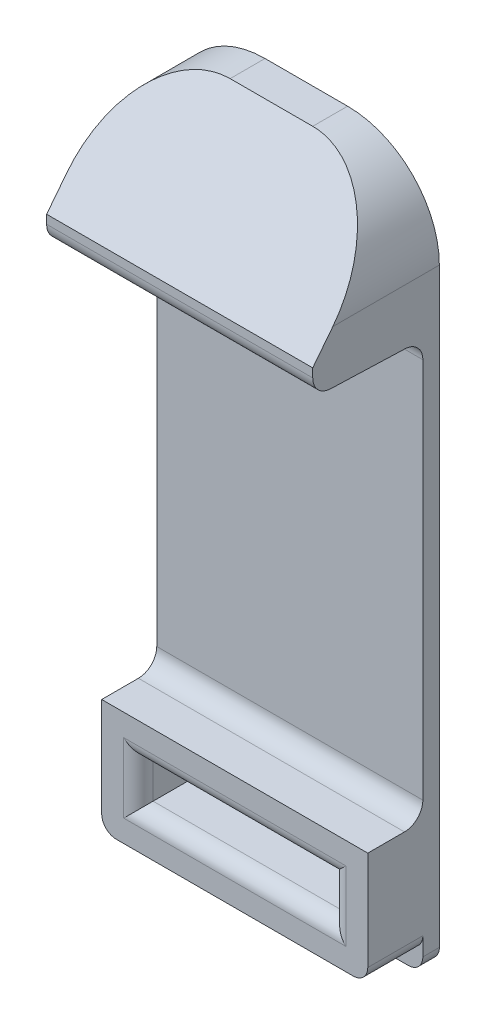
ISO-10303-21;
HEADER;
FILE_DESCRIPTION(('STEP AP214'),'2;1');
FILE_NAME('part.step','',(''),(''),'','','');
FILE_SCHEMA(('AUTOMOTIVE_DESIGN { 1 0 10303 214 1 1 1 1 }'));
ENDSEC;
DATA;
#1=APPLICATION_CONTEXT('core data for automotive mechanical design processes');
#2=APPLICATION_PROTOCOL_DEFINITION('international standard','automotive_design',2000,#1);
#3=PRODUCT_CONTEXT('',#1,'mechanical');
#4=PRODUCT('Part','Part','',(#3));
#5=PRODUCT_RELATED_PRODUCT_CATEGORY('part','',(#4));
#6=PRODUCT_DEFINITION_FORMATION('','',#4);
#7=PRODUCT_DEFINITION_CONTEXT('part definition',#1,'design');
#8=PRODUCT_DEFINITION('design','',#6,#7);
#9=PRODUCT_DEFINITION_SHAPE('','',#8);
#10=(LENGTH_UNIT() NAMED_UNIT(*) SI_UNIT(.MILLI.,.METRE.));
#11=(NAMED_UNIT(*) PLANE_ANGLE_UNIT() SI_UNIT($,.RADIAN.));
#12=(NAMED_UNIT(*) SI_UNIT($,.STERADIAN.) SOLID_ANGLE_UNIT());
#13=UNCERTAINTY_MEASURE_WITH_UNIT(LENGTH_MEASURE(1.E-05),#10,'distance_accuracy_value','');
#14=(GEOMETRIC_REPRESENTATION_CONTEXT(3) GLOBAL_UNCERTAINTY_ASSIGNED_CONTEXT((#13)) GLOBAL_UNIT_ASSIGNED_CONTEXT((#10,
#11,#12)) REPRESENTATION_CONTEXT('',''));
#15=CARTESIAN_POINT('',(0.,0.,0.));
#16=DIRECTION('',(0.,0.,1.));
#17=DIRECTION('',(1.,0.,0.));
#18=AXIS2_PLACEMENT_3D('',#15,#16,#17);
#19=CARTESIAN_POINT('',(0.,0.,0.9));
#20=DIRECTION('',(0.,0.,-1.));
#21=DIRECTION('',(-1.,0.,0.));
#22=AXIS2_PLACEMENT_3D('',#19,#20,#21);
#23=PLANE('',#22);
#24=DIRECTION('',(0.,1.,0.));
#25=VECTOR('',#24,1.);
#26=CARTESIAN_POINT('',(7.25,-3.,0.9));
#27=LINE('',#26,#25);
#28=CARTESIAN_POINT('',(7.25,5.19999999999999,0.9));
#29=VERTEX_POINT('',#28);
#30=CARTESIAN_POINT('',(7.25000000000001,25.9843112251929,0.9));
#31=VERTEX_POINT('',#30);
#32=EDGE_CURVE('E281',#29,#31,#27,.T.);
#33=ORIENTED_EDGE('',*,*,#32,.T.);
#34=DIRECTION('',(-1.,0.,0.));
#35=VECTOR('',#34,1.);
#36=CARTESIAN_POINT('',(-7.25,25.9843112251929,0.9));
#37=LINE('',#36,#35);
#38=CARTESIAN_POINT('',(-7.25000000000001,25.9843112251929,0.9));
#39=VERTEX_POINT('',#38);
#40=EDGE_CURVE('E323',#31,#39,#37,.T.);
#41=ORIENTED_EDGE('',*,*,#40,.T.);
#42=DIRECTION('',(0.,-1.,0.));
#43=VECTOR('',#42,1.);
#44=CARTESIAN_POINT('',(-7.25,-3.,0.9));
#45=LINE('',#44,#43);
#46=CARTESIAN_POINT('',(-7.25,5.19999999999999,0.9));
#47=VERTEX_POINT('',#46);
#48=EDGE_CURVE('E274',#39,#47,#45,.T.);
#49=ORIENTED_EDGE('',*,*,#48,.T.);
#50=DIRECTION('',(-1.,0.,0.));
#51=VECTOR('',#50,1.);
#52=CARTESIAN_POINT('',(7.25,5.19999999999999,0.9));
#53=LINE('',#52,#51);
#54=EDGE_CURVE('E321',#47,#29,#53,.F.);
#55=ORIENTED_EDGE('',*,*,#54,.T.);
#56=EDGE_LOOP('',(#33,#41,#49,#55));
#57=FACE_BOUND('',#56,.T.);
#58=ADVANCED_FACE('F35',(#57),#23,.F.);
#59=DIRECTION('',(1.,0.,0.));
#60=VECTOR('',#59,1.);
#61=CARTESIAN_POINT('',(-7.25,-3.,0.9));
#62=LINE('',#61,#60);
#63=CARTESIAN_POINT('',(-6.45,-3.,0.9));
#64=VERTEX_POINT('',#63);
#65=CARTESIAN_POINT('',(6.45,-3.,0.9));
#66=VERTEX_POINT('',#65);
#67=EDGE_CURVE('E277',#64,#66,#62,.T.);
#68=ORIENTED_EDGE('',*,*,#67,.T.);
#69=CARTESIAN_POINT('',(6.45,-2.2,0.9));
#70=DIRECTION('',(0.,0.,-1.));
#71=DIRECTION('',(-1.,0.,0.));
#72=AXIS2_PLACEMENT_3D('',#69,#70,#71);
#73=CIRCLE('',#72,0.8);
#74=CARTESIAN_POINT('',(7.25,-2.2,0.9));
#75=VERTEX_POINT('',#74);
#76=EDGE_CURVE('E386',#66,#75,#73,.F.);
#77=ORIENTED_EDGE('',*,*,#76,.T.);
#78=CARTESIAN_POINT('',(7.25,-1.2,0.9));
#79=VERTEX_POINT('',#78);
#80=EDGE_CURVE('E282',#75,#79,#27,.T.);
#81=ORIENTED_EDGE('',*,*,#80,.T.);
#82=CARTESIAN_POINT('',(6.45,-1.2,0.9));
#83=DIRECTION('',(0.,0.,-1.));
#84=DIRECTION('',(-1.,0.,0.));
#85=AXIS2_PLACEMENT_3D('',#82,#83,#84);
#86=CIRCLE('',#85,0.8);
#87=CARTESIAN_POINT('',(6.45,-2.,0.9));
#88=VERTEX_POINT('',#87);
#89=EDGE_CURVE('E44',#79,#88,#86,.T.);
#90=ORIENTED_EDGE('',*,*,#89,.T.);
#91=DIRECTION('',(1.,0.,0.));
#92=VECTOR('',#91,1.);
#93=CARTESIAN_POINT('',(0.,-2.,0.9));
#94=LINE('',#93,#92);
#95=CARTESIAN_POINT('',(-6.45,-2.,0.9));
#96=VERTEX_POINT('',#95);
#97=EDGE_CURVE('E223',#96,#88,#94,.T.);
#98=ORIENTED_EDGE('',*,*,#97,.F.);
#99=CARTESIAN_POINT('',(-6.45,-1.2,0.9));
#100=DIRECTION('',(0.,0.,-1.));
#101=DIRECTION('',(-1.,0.,0.));
#102=AXIS2_PLACEMENT_3D('',#99,#100,#101);
#103=CIRCLE('',#102,0.8);
#104=CARTESIAN_POINT('',(-7.25,-1.2,0.9));
#105=VERTEX_POINT('',#104);
#106=EDGE_CURVE('E11',#96,#105,#103,.T.);
#107=ORIENTED_EDGE('',*,*,#106,.T.);
#108=CARTESIAN_POINT('',(-7.25,-2.2,0.9));
#109=VERTEX_POINT('',#108);
#110=EDGE_CURVE('E278',#105,#109,#45,.T.);
#111=ORIENTED_EDGE('',*,*,#110,.T.);
#112=CARTESIAN_POINT('',(-6.45,-2.2,0.9));
#113=DIRECTION('',(0.,0.,-1.));
#114=DIRECTION('',(-1.,0.,0.));
#115=AXIS2_PLACEMENT_3D('',#112,#113,#114);
#116=CIRCLE('',#115,0.8);
#117=EDGE_CURVE('E384',#109,#64,#116,.F.);
#118=ORIENTED_EDGE('',*,*,#117,.T.);
#119=EDGE_LOOP('',(#68,#77,#81,#90,#98,#107,#111,#118));
#120=FACE_BOUND('',#119,.T.);
#121=ADVANCED_FACE('F428',(#120),#23,.F.);
#122=CARTESIAN_POINT('',(0.,0.,0.));
#123=DIRECTION('',(0.,0.,-1.));
#124=DIRECTION('',(-1.,0.,0.));
#125=AXIS2_PLACEMENT_3D('',#122,#123,#124);
#126=PLANE('',#125);
#127=DIRECTION('',(0.,1.,0.));
#128=VECTOR('',#127,1.);
#129=CARTESIAN_POINT('',(7.25,-3.,0.));
#130=LINE('',#129,#128);
#131=CARTESIAN_POINT('',(7.25,-2.2,0.));
#132=VERTEX_POINT('',#131);
#133=CARTESIAN_POINT('',(7.25000000000001,30.,0.));
#134=VERTEX_POINT('',#133);
#135=EDGE_CURVE('E290',#132,#134,#130,.T.);
#136=ORIENTED_EDGE('',*,*,#135,.F.);
#137=CARTESIAN_POINT('',(6.45,-2.2,0.));
#138=DIRECTION('',(0.,0.,-1.));
#139=DIRECTION('',(-1.,0.,0.));
#140=AXIS2_PLACEMENT_3D('',#137,#138,#139);
#141=CIRCLE('',#140,0.8);
#142=CARTESIAN_POINT('',(6.45,-3.,0.));
#143=VERTEX_POINT('',#142);
#144=EDGE_CURVE('E377',#132,#143,#141,.T.);
#145=ORIENTED_EDGE('',*,*,#144,.T.);
#146=DIRECTION('',(1.,0.,0.));
#147=VECTOR('',#146,1.);
#148=CARTESIAN_POINT('',(-7.25,-3.,0.));
#149=LINE('',#148,#147);
#150=CARTESIAN_POINT('',(-6.45,-3.,0.));
#151=VERTEX_POINT('',#150);
#152=EDGE_CURVE('E287',#151,#143,#149,.T.);
#153=ORIENTED_EDGE('',*,*,#152,.F.);
#154=CARTESIAN_POINT('',(-6.45,-2.2,0.));
#155=DIRECTION('',(0.,0.,-1.));
#156=DIRECTION('',(-1.,0.,0.));
#157=AXIS2_PLACEMENT_3D('',#154,#155,#156);
#158=CIRCLE('',#157,0.8);
#159=CARTESIAN_POINT('',(-7.25,-2.2,0.));
#160=VERTEX_POINT('',#159);
#161=EDGE_CURVE('E375',#151,#160,#158,.T.);
#162=ORIENTED_EDGE('',*,*,#161,.T.);
#163=DIRECTION('',(0.,-1.,0.));
#164=VECTOR('',#163,1.);
#165=CARTESIAN_POINT('',(-7.25,-3.,0.));
#166=LINE('',#165,#164);
#167=CARTESIAN_POINT('',(-7.25000000000001,30.,0.));
#168=VERTEX_POINT('',#167);
#169=EDGE_CURVE('E273',#168,#160,#166,.T.);
#170=ORIENTED_EDGE('',*,*,#169,.F.);
#171=CARTESIAN_POINT('',(-2.25000000000001,30.,0.));
#172=DIRECTION('',(0.,0.,-1.));
#173=DIRECTION('',(-1.,0.,0.));
#174=AXIS2_PLACEMENT_3D('',#171,#172,#173);
#175=CIRCLE('',#174,5.);
#176=CARTESIAN_POINT('',(-2.25000000000001,35.,0.));
#177=VERTEX_POINT('',#176);
#178=EDGE_CURVE('E339',#168,#177,#175,.T.);
#179=ORIENTED_EDGE('',*,*,#178,.T.);
#180=DIRECTION('',(-1.,0.,0.));
#181=VECTOR('',#180,1.);
#182=CARTESIAN_POINT('',(-7.25000000000001,35.,0.));
#183=LINE('',#182,#181);
#184=CARTESIAN_POINT('',(2.25000000000001,35.,0.));
#185=VERTEX_POINT('',#184);
#186=EDGE_CURVE('E292',#185,#177,#183,.T.);
#187=ORIENTED_EDGE('',*,*,#186,.F.);
#188=CARTESIAN_POINT('',(2.25000000000001,30.,0.));
#189=DIRECTION('',(0.,0.,-1.));
#190=DIRECTION('',(-1.,0.,0.));
#191=AXIS2_PLACEMENT_3D('',#188,#189,#190);
#192=CIRCLE('',#191,5.);
#193=EDGE_CURVE('E341',#185,#134,#192,.T.);
#194=ORIENTED_EDGE('',*,*,#193,.T.);
#195=EDGE_LOOP('',(#136,#145,#153,#162,#170,#179,#187,#194));
#196=FACE_BOUND('',#195,.T.);
#197=DIRECTION('',(-1.,0.,0.));
#198=VECTOR('',#197,1.);
#199=CARTESIAN_POINT('',(-5.25000000000001,2.19999999999999,0.));
#200=LINE('',#199,#198);
#201=CARTESIAN_POINT('',(5.24999999999999,2.19999999999999,0.));
#202=VERTEX_POINT('',#201);
#203=CARTESIAN_POINT('',(-5.25000000000001,2.19999999999999,0.));
#204=VERTEX_POINT('',#203);
#205=EDGE_CURVE('E262',#202,#204,#200,.T.);
#206=ORIENTED_EDGE('',*,*,#205,.T.);
#207=DIRECTION('',(0.,-1.,0.));
#208=VECTOR('',#207,1.);
#209=CARTESIAN_POINT('',(-5.25,0.,0.));
#210=LINE('',#209,#208);
#211=CARTESIAN_POINT('',(-5.25,0.,0.));
#212=VERTEX_POINT('',#211);
#213=EDGE_CURVE('E252',#204,#212,#210,.T.);
#214=ORIENTED_EDGE('',*,*,#213,.T.);
#215=DIRECTION('',(1.,0.,0.));
#216=VECTOR('',#215,1.);
#217=CARTESIAN_POINT('',(-5.25,0.,0.));
#218=LINE('',#217,#216);
#219=CARTESIAN_POINT('',(5.25,0.,0.));
#220=VERTEX_POINT('',#219);
#221=EDGE_CURVE('E255',#212,#220,#218,.T.);
#222=ORIENTED_EDGE('',*,*,#221,.T.);
#223=DIRECTION('',(0.,1.,0.));
#224=VECTOR('',#223,1.);
#225=CARTESIAN_POINT('',(5.25,0.,0.));
#226=LINE('',#225,#224);
#227=EDGE_CURVE('E259',#220,#202,#226,.T.);
#228=ORIENTED_EDGE('',*,*,#227,.T.);
#229=EDGE_LOOP('',(#206,#214,#222,#228));
#230=FACE_BOUND('',#229,.T.);
#231=ADVANCED_FACE('F442',(#196,#230),#126,.T.);
#232=CARTESIAN_POINT('',(-7.25,-3.,0.9));
#233=DIRECTION('',(1.,0.,0.));
#234=DIRECTION('',(0.,1.,0.));
#235=AXIS2_PLACEMENT_3D('',#232,#233,#234);
#236=PLANE('',#235);
#237=ORIENTED_EDGE('',*,*,#110,.F.);
#238=DIRECTION('',(0.,0.,-1.));
#239=VECTOR('',#238,1.);
#240=CARTESIAN_POINT('',(-7.25,-1.2,0.9));
#241=LINE('',#240,#239);
#242=CARTESIAN_POINT('',(-7.25,-1.2,3.9));
#243=VERTEX_POINT('',#242);
#244=EDGE_CURVE('E390',#105,#243,#241,.F.);
#245=ORIENTED_EDGE('',*,*,#244,.T.);
#246=DIRECTION('',(0.,-1.,0.));
#247=VECTOR('',#246,1.);
#248=CARTESIAN_POINT('',(-7.25,0.,3.9));
#249=LINE('',#248,#247);
#250=CARTESIAN_POINT('',(-7.25,4.19999999999999,3.9));
#251=VERTEX_POINT('',#250);
#252=EDGE_CURVE('E234',#251,#243,#249,.T.);
#253=ORIENTED_EDGE('',*,*,#252,.F.);
#254=DIRECTION('',(0.,0.,-1.));
#255=VECTOR('',#254,1.);
#256=CARTESIAN_POINT('',(-7.25,4.19999999999999,3.9));
#257=LINE('',#256,#255);
#258=CARTESIAN_POINT('',(-7.25,4.19999999999999,1.9));
#259=VERTEX_POINT('',#258);
#260=EDGE_CURVE('E232',#251,#259,#257,.T.);
#261=ORIENTED_EDGE('',*,*,#260,.T.);
#262=CARTESIAN_POINT('',(-7.25,5.19999999999999,1.9));
#263=DIRECTION('',(1.,0.,0.));
#264=DIRECTION('',(0.,1.,0.));
#265=AXIS2_PLACEMENT_3D('',#262,#263,#264);
#266=CIRCLE('',#265,1.);
#267=EDGE_CURVE('E331',#259,#47,#266,.T.);
#268=ORIENTED_EDGE('',*,*,#267,.T.);
#269=ORIENTED_EDGE('',*,*,#48,.F.);
#270=CARTESIAN_POINT('',(-7.25000000000001,25.9843112251929,1.9));
#271=DIRECTION('',(1.,0.,0.));
#272=DIRECTION('',(0.,1.,0.));
#273=AXIS2_PLACEMENT_3D('',#270,#271,#272);
#274=CIRCLE('',#273,1.);
#275=CARTESIAN_POINT('',(-7.25000000000001,26.983702052212,1.8651005032975));
#276=VERTEX_POINT('',#275);
#277=EDGE_CURVE('E329',#39,#276,#274,.T.);
#278=ORIENTED_EDGE('',*,*,#277,.T.);
#279=DIRECTION('',(0.,0.034899496702501,0.999390827019096));
#280=VECTOR('',#279,1.);
#281=CARTESIAN_POINT('',(-7.25000000000001,26.95,0.9));
#282=LINE('',#281,#280);
#283=CARTESIAN_POINT('',(-7.25000000000001,27.1258225647385,5.9348994967025));
#284=VERTEX_POINT('',#283);
#285=EDGE_CURVE('E256',#284,#276,#282,.F.);
#286=ORIENTED_EDGE('',*,*,#285,.F.);
#287=CARTESIAN_POINT('',(-7.25000000000001,28.1252133917575,5.9));
#288=DIRECTION('',(1.,0.,0.));
#289=DIRECTION('',(0.,1.,0.));
#290=AXIS2_PLACEMENT_3D('',#287,#288,#289);
#291=CIRCLE('',#290,1.);
#292=CARTESIAN_POINT('',(-7.25000000000001,28.1252133917575,6.9));
#293=VERTEX_POINT('',#292);
#294=EDGE_CURVE('E316',#284,#293,#291,.F.);
#295=ORIENTED_EDGE('',*,*,#294,.T.);
#296=DIRECTION('',(0.,-1.,0.));
#297=VECTOR('',#296,1.);
#298=CARTESIAN_POINT('',(-7.25,0.,6.9));
#299=LINE('',#298,#297);
#300=CARTESIAN_POINT('',(-7.25000000000001,28.6002918390346,6.9));
#301=VERTEX_POINT('',#300);
#302=EDGE_CURVE('E240',#301,#293,#299,.T.);
#303=ORIENTED_EDGE('',*,*,#302,.F.);
#304=DIRECTION('',(0.,0.788010753606721,-0.61566147532566));
#305=VECTOR('',#304,1.);
#306=CARTESIAN_POINT('',(-7.25000000000001,28.6002918390346,6.9));
#307=LINE('',#306,#305);
#308=CARTESIAN_POINT('',(-7.25000000000001,30.,5.80642813253359));
#309=VERTEX_POINT('',#308);
#310=EDGE_CURVE('E301',#301,#309,#307,.T.);
#311=ORIENTED_EDGE('',*,*,#310,.T.);
#312=DIRECTION('',(0.,0.,-1.));
#313=VECTOR('',#312,1.);
#314=CARTESIAN_POINT('',(-7.25000000000001,30.,0.9));
#315=LINE('',#314,#313);
#316=EDGE_CURVE('E350',#309,#168,#315,.T.);
#317=ORIENTED_EDGE('',*,*,#316,.T.);
#318=ORIENTED_EDGE('',*,*,#169,.T.);
#319=DIRECTION('',(0.,0.,-1.));
#320=VECTOR('',#319,1.);
#321=CARTESIAN_POINT('',(-7.25,-2.2,0.9));
#322=LINE('',#321,#320);
#323=EDGE_CURVE('E388',#160,#109,#322,.F.);
#324=ORIENTED_EDGE('',*,*,#323,.T.);
#325=EDGE_LOOP('',(#237,#245,#253,#261,#268,#269,#278,#286,#295,#303,#311,#317,#318,#324));
#326=FACE_BOUND('',#325,.T.);
#327=ADVANCED_FACE('F453',(#326),#236,.F.);
#328=CARTESIAN_POINT('',(-7.25,-3.,0.9));
#329=DIRECTION('',(0.,1.,0.));
#330=DIRECTION('',(0.,0.,1.));
#331=AXIS2_PLACEMENT_3D('',#328,#329,#330);
#332=PLANE('',#331);
#333=ORIENTED_EDGE('',*,*,#152,.T.);
#334=DIRECTION('',(0.,0.,-1.));
#335=VECTOR('',#334,1.);
#336=CARTESIAN_POINT('',(6.45,-3.,0.9));
#337=LINE('',#336,#335);
#338=EDGE_CURVE('E382',#143,#66,#337,.F.);
#339=ORIENTED_EDGE('',*,*,#338,.T.);
#340=ORIENTED_EDGE('',*,*,#67,.F.);
#341=DIRECTION('',(0.,0.,-1.));
#342=VECTOR('',#341,1.);
#343=CARTESIAN_POINT('',(-6.45,-3.,0.9));
#344=LINE('',#343,#342);
#345=EDGE_CURVE('E379',#64,#151,#344,.T.);
#346=ORIENTED_EDGE('',*,*,#345,.T.);
#347=EDGE_LOOP('',(#333,#339,#340,#346));
#348=FACE_BOUND('',#347,.T.);
#349=ADVANCED_FACE('F445',(#348),#332,.F.);
#350=CARTESIAN_POINT('',(7.25,-3.,0.9));
#351=DIRECTION('',(-1.,0.,0.));
#352=DIRECTION('',(0.,-1.,0.));
#353=AXIS2_PLACEMENT_3D('',#350,#351,#352);
#354=PLANE('',#353);
#355=DIRECTION('',(0.,1.,0.));
#356=VECTOR('',#355,1.);
#357=CARTESIAN_POINT('',(7.25,0.,3.9));
#358=LINE('',#357,#356);
#359=CARTESIAN_POINT('',(7.25,-1.2,3.9));
#360=VERTEX_POINT('',#359);
#361=CARTESIAN_POINT('',(7.25,4.19999999999999,3.9));
#362=VERTEX_POINT('',#361);
#363=EDGE_CURVE('E210',#360,#362,#358,.T.);
#364=ORIENTED_EDGE('',*,*,#363,.F.);
#365=DIRECTION('',(0.,0.,-1.));
#366=VECTOR('',#365,1.);
#367=CARTESIAN_POINT('',(7.25,-1.2,0.9));
#368=LINE('',#367,#366);
#369=EDGE_CURVE('E356',#360,#79,#368,.T.);
#370=ORIENTED_EDGE('',*,*,#369,.T.);
#371=ORIENTED_EDGE('',*,*,#80,.F.);
#372=DIRECTION('',(0.,0.,-1.));
#373=VECTOR('',#372,1.);
#374=CARTESIAN_POINT('',(7.25,-2.2,0.9));
#375=LINE('',#374,#373);
#376=EDGE_CURVE('E353',#75,#132,#375,.T.);
#377=ORIENTED_EDGE('',*,*,#376,.T.);
#378=ORIENTED_EDGE('',*,*,#135,.T.);
#379=DIRECTION('',(0.,0.,-1.));
#380=VECTOR('',#379,1.);
#381=CARTESIAN_POINT('',(7.25000000000001,30.,0.9));
#382=LINE('',#381,#380);
#383=CARTESIAN_POINT('',(7.25000000000001,30.,5.80642813253359));
#384=VERTEX_POINT('',#383);
#385=EDGE_CURVE('E344',#134,#384,#382,.F.);
#386=ORIENTED_EDGE('',*,*,#385,.T.);
#387=DIRECTION('',(0.,-0.788010753606721,0.61566147532566));
#388=VECTOR('',#387,1.);
#389=CARTESIAN_POINT('',(7.25000000000001,28.6002918390346,6.9));
#390=LINE('',#389,#388);
#391=CARTESIAN_POINT('',(7.25000000000001,28.6002918390346,6.9));
#392=VERTEX_POINT('',#391);
#393=EDGE_CURVE('E307',#384,#392,#390,.T.);
#394=ORIENTED_EDGE('',*,*,#393,.T.);
#395=DIRECTION('',(0.,1.,0.));
#396=VECTOR('',#395,1.);
#397=CARTESIAN_POINT('',(7.25,0.,6.9));
#398=LINE('',#397,#396);
#399=CARTESIAN_POINT('',(7.25000000000001,28.1252133917575,6.9));
#400=VERTEX_POINT('',#399);
#401=EDGE_CURVE('E243',#400,#392,#398,.T.);
#402=ORIENTED_EDGE('',*,*,#401,.F.);
#403=CARTESIAN_POINT('',(7.25000000000001,28.1252133917575,5.9));
#404=DIRECTION('',(-1.,0.,0.));
#405=DIRECTION('',(0.,-1.,0.));
#406=AXIS2_PLACEMENT_3D('',#403,#404,#405);
#407=CIRCLE('',#406,1.);
#408=CARTESIAN_POINT('',(7.25000000000001,27.1258225647385,5.9348994967025));
#409=VERTEX_POINT('',#408);
#410=EDGE_CURVE('E312',#400,#409,#407,.F.);
#411=ORIENTED_EDGE('',*,*,#410,.T.);
#412=DIRECTION('',(0.,0.034899496702501,0.999390827019096));
#413=VECTOR('',#412,1.);
#414=CARTESIAN_POINT('',(7.25000000000001,26.9135216526409,-0.144603194318278));
#415=LINE('',#414,#413);
#416=CARTESIAN_POINT('',(7.25000000000001,26.983702052212,1.8651005032975));
#417=VERTEX_POINT('',#416);
#418=EDGE_CURVE('E251',#409,#417,#415,.F.);
#419=ORIENTED_EDGE('',*,*,#418,.T.);
#420=CARTESIAN_POINT('',(7.25000000000001,25.9843112251929,1.9));
#421=DIRECTION('',(-1.,0.,0.));
#422=DIRECTION('',(0.,-1.,0.));
#423=AXIS2_PLACEMENT_3D('',#420,#421,#422);
#424=CIRCLE('',#423,1.);
#425=EDGE_CURVE('E327',#417,#31,#424,.T.);
#426=ORIENTED_EDGE('',*,*,#425,.T.);
#427=ORIENTED_EDGE('',*,*,#32,.F.);
#428=CARTESIAN_POINT('',(7.25,5.19999999999999,1.9));
#429=DIRECTION('',(-1.,0.,0.));
#430=DIRECTION('',(0.,-1.,0.));
#431=AXIS2_PLACEMENT_3D('',#428,#429,#430);
#432=CIRCLE('',#431,1.);
#433=CARTESIAN_POINT('',(7.25,4.19999999999999,1.9));
#434=VERTEX_POINT('',#433);
#435=EDGE_CURVE('E239',#29,#434,#432,.T.);
#436=ORIENTED_EDGE('',*,*,#435,.T.);
#437=DIRECTION('',(0.,0.,-1.));
#438=VECTOR('',#437,1.);
#439=CARTESIAN_POINT('',(7.25,4.19999999999999,3.9));
#440=LINE('',#439,#438);
#441=EDGE_CURVE('E229',#362,#434,#440,.T.);
#442=ORIENTED_EDGE('',*,*,#441,.F.);
#443=EDGE_LOOP('',(#364,#370,#371,#377,#378,#386,#394,#402,#411,#419,#426,#427,#436,#442));
#444=FACE_BOUND('',#443,.T.);
#445=ADVANCED_FACE('F236',(#444),#354,.F.);
#446=CARTESIAN_POINT('',(-7.25000000000001,35.,0.9));
#447=DIRECTION('',(0.,-1.,0.));
#448=DIRECTION('',(0.,0.,-1.));
#449=AXIS2_PLACEMENT_3D('',#446,#447,#448);
#450=PLANE('',#449);
#451=DIRECTION('',(1.,0.,0.));
#452=VECTOR('',#451,1.);
#453=CARTESIAN_POINT('',(7.25000000000001,35.,1.89999999999998));
#454=LINE('',#453,#452);
#455=CARTESIAN_POINT('',(-2.25000000000001,35.,1.89999999999998));
#456=VERTEX_POINT('',#455);
#457=CARTESIAN_POINT('',(2.25000000000001,35.,1.89999999999998));
#458=VERTEX_POINT('',#457);
#459=EDGE_CURVE('E304',#456,#458,#454,.T.);
#460=ORIENTED_EDGE('',*,*,#459,.T.);
#461=DIRECTION('',(0.,0.,-1.));
#462=VECTOR('',#461,1.);
#463=CARTESIAN_POINT('',(2.25000000000001,35.,0.9));
#464=LINE('',#463,#462);
#465=EDGE_CURVE('E336',#458,#185,#464,.T.);
#466=ORIENTED_EDGE('',*,*,#465,.T.);
#467=ORIENTED_EDGE('',*,*,#186,.T.);
#468=DIRECTION('',(0.,0.,-1.));
#469=VECTOR('',#468,1.);
#470=CARTESIAN_POINT('',(-2.25000000000001,35.,0.9));
#471=LINE('',#470,#469);
#472=EDGE_CURVE('E334',#177,#456,#471,.F.);
#473=ORIENTED_EDGE('',*,*,#472,.T.);
#474=EDGE_LOOP('',(#460,#466,#467,#473));
#475=FACE_BOUND('',#474,.T.);
#476=ADVANCED_FACE('F462',(#475),#450,.F.);
#477=CARTESIAN_POINT('',(-5.25,0.,0.9));
#478=DIRECTION('',(1.,0.,0.));
#479=DIRECTION('',(0.,1.,0.));
#480=AXIS2_PLACEMENT_3D('',#477,#478,#479);
#481=PLANE('',#480);
#482=DIRECTION('',(0.,0.,-1.));
#483=VECTOR('',#482,1.);
#484=CARTESIAN_POINT('',(-5.25000000000001,2.19999999999999,0.9));
#485=LINE('',#484,#483);
#486=CARTESIAN_POINT('',(-5.25000000000001,2.19999999999999,3.1));
#487=VERTEX_POINT('',#486);
#488=EDGE_CURVE('E265',#487,#204,#485,.T.);
#489=ORIENTED_EDGE('',*,*,#488,.F.);
#490=DIRECTION('',(0.,1.,0.));
#491=VECTOR('',#490,1.);
#492=CARTESIAN_POINT('',(-5.25,0.,3.1));
#493=LINE('',#492,#491);
#494=CARTESIAN_POINT('',(-5.25,0.,3.1));
#495=VERTEX_POINT('',#494);
#496=EDGE_CURVE('E396',#487,#495,#493,.F.);
#497=ORIENTED_EDGE('',*,*,#496,.T.);
#498=DIRECTION('',(0.,0.,-1.));
#499=VECTOR('',#498,1.);
#500=CARTESIAN_POINT('',(-5.25,0.,0.9));
#501=LINE('',#500,#499);
#502=EDGE_CURVE('E271',#495,#212,#501,.T.);
#503=ORIENTED_EDGE('',*,*,#502,.T.);
#504=ORIENTED_EDGE('',*,*,#213,.F.);
#505=EDGE_LOOP('',(#489,#497,#503,#504));
#506=FACE_BOUND('',#505,.T.);
#507=ADVANCED_FACE('F511',(#506),#481,.T.);
#508=CARTESIAN_POINT('',(-5.25,0.,0.9));
#509=DIRECTION('',(0.,1.,0.));
#510=DIRECTION('',(-1.,0.,0.));
#511=AXIS2_PLACEMENT_3D('',#508,#509,#510);
#512=PLANE('',#511);
#513=ORIENTED_EDGE('',*,*,#502,.F.);
#514=DIRECTION('',(-1.,0.,0.));
#515=VECTOR('',#514,1.);
#516=CARTESIAN_POINT('',(-5.25,0.,3.1));
#517=LINE('',#516,#515);
#518=CARTESIAN_POINT('',(5.25,0.,3.1));
#519=VERTEX_POINT('',#518);
#520=EDGE_CURVE('E392',#495,#519,#517,.F.);
#521=ORIENTED_EDGE('',*,*,#520,.T.);
#522=DIRECTION('',(0.,0.,-1.));
#523=VECTOR('',#522,1.);
#524=CARTESIAN_POINT('',(5.25,0.,0.9));
#525=LINE('',#524,#523);
#526=EDGE_CURVE('E269',#519,#220,#525,.T.);
#527=ORIENTED_EDGE('',*,*,#526,.T.);
#528=ORIENTED_EDGE('',*,*,#221,.F.);
#529=EDGE_LOOP('',(#513,#521,#527,#528));
#530=FACE_BOUND('',#529,.T.);
#531=ADVANCED_FACE('F623',(#530),#512,.T.);
#532=CARTESIAN_POINT('',(5.25,0.,0.9));
#533=DIRECTION('',(-1.,0.,0.));
#534=DIRECTION('',(0.,-1.,0.));
#535=AXIS2_PLACEMENT_3D('',#532,#533,#534);
#536=PLANE('',#535);
#537=ORIENTED_EDGE('',*,*,#526,.F.);
#538=DIRECTION('',(0.,-1.,0.));
#539=VECTOR('',#538,1.);
#540=CARTESIAN_POINT('',(5.25,0.,3.1));
#541=LINE('',#540,#539);
#542=CARTESIAN_POINT('',(5.24999999999999,2.19999999999999,3.1));
#543=VERTEX_POINT('',#542);
#544=EDGE_CURVE('E60',#519,#543,#541,.F.);
#545=ORIENTED_EDGE('',*,*,#544,.T.);
#546=DIRECTION('',(0.,0.,-1.));
#547=VECTOR('',#546,1.);
#548=CARTESIAN_POINT('',(5.24999999999999,2.19999999999999,0.9));
#549=LINE('',#548,#547);
#550=EDGE_CURVE('E267',#543,#202,#549,.T.);
#551=ORIENTED_EDGE('',*,*,#550,.T.);
#552=ORIENTED_EDGE('',*,*,#227,.F.);
#553=EDGE_LOOP('',(#537,#545,#551,#552));
#554=FACE_BOUND('',#553,.T.);
#555=ADVANCED_FACE('F633',(#554),#536,.T.);
#556=CARTESIAN_POINT('',(-5.25000000000001,2.19999999999999,0.9));
#557=DIRECTION('',(0.,-1.,0.));
#558=DIRECTION('',(1.,0.,0.));
#559=AXIS2_PLACEMENT_3D('',#556,#557,#558);
#560=PLANE('',#559);
#561=ORIENTED_EDGE('',*,*,#550,.F.);
#562=DIRECTION('',(1.,0.,0.));
#563=VECTOR('',#562,1.);
#564=CARTESIAN_POINT('',(-5.25000000000001,2.19999999999999,3.1));
#565=LINE('',#564,#563);
#566=EDGE_CURVE('E52',#543,#487,#565,.F.);
#567=ORIENTED_EDGE('',*,*,#566,.T.);
#568=ORIENTED_EDGE('',*,*,#488,.T.);
#569=ORIENTED_EDGE('',*,*,#205,.F.);
#570=EDGE_LOOP('',(#561,#567,#568,#569));
#571=FACE_BOUND('',#570,.T.);
#572=ADVANCED_FACE('F525',(#571),#560,.T.);
#573=CARTESIAN_POINT('',(0.,26.95,0.9));
#574=DIRECTION('',(0.,-0.999390827019096,0.034899496702501));
#575=DIRECTION('',(0.,-0.034899496702501,-0.999390827019096));
#576=AXIS2_PLACEMENT_3D('',#573,#574,#575);
#577=PLANE('',#576);
#578=ORIENTED_EDGE('',*,*,#285,.T.);
#579=DIRECTION('',(1.,0.,0.));
#580=VECTOR('',#579,1.);
#581=CARTESIAN_POINT('',(7.25,26.983702052212,1.8651005032975));
#582=LINE('',#581,#580);
#583=EDGE_CURVE('E318',#276,#417,#582,.T.);
#584=ORIENTED_EDGE('',*,*,#583,.T.);
#585=ORIENTED_EDGE('',*,*,#418,.F.);
#586=DIRECTION('',(1.,0.,0.));
#587=VECTOR('',#586,1.);
#588=CARTESIAN_POINT('',(-7.25,27.1258225647385,5.9348994967025));
#589=LINE('',#588,#587);
#590=EDGE_CURVE('E314',#409,#284,#589,.F.);
#591=ORIENTED_EDGE('',*,*,#590,.T.);
#592=EDGE_LOOP('',(#578,#584,#585,#591));
#593=FACE_BOUND('',#592,.T.);
#594=ADVANCED_FACE('F484',(#593),#577,.T.);
#595=CARTESIAN_POINT('',(0.,0.,6.9));
#596=DIRECTION('',(0.,0.,1.));
#597=DIRECTION('',(1.,0.,0.));
#598=AXIS2_PLACEMENT_3D('',#595,#596,#597);
#599=PLANE('',#598);
#600=ORIENTED_EDGE('',*,*,#302,.T.);
#601=DIRECTION('',(-1.,0.,0.));
#602=VECTOR('',#601,1.);
#603=CARTESIAN_POINT('',(7.25,28.1252133917575,6.9));
#604=LINE('',#603,#602);
#605=EDGE_CURVE('E309',#293,#400,#604,.F.);
#606=ORIENTED_EDGE('',*,*,#605,.T.);
#607=ORIENTED_EDGE('',*,*,#401,.T.);
#608=DIRECTION('',(-1.,0.,0.));
#609=VECTOR('',#608,1.);
#610=CARTESIAN_POINT('',(-7.25000000000001,28.6002918390346,6.9));
#611=LINE('',#610,#609);
#612=EDGE_CURVE('E284',#392,#301,#611,.T.);
#613=ORIENTED_EDGE('',*,*,#612,.T.);
#614=EDGE_LOOP('',(#600,#606,#607,#613));
#615=FACE_BOUND('',#614,.T.);
#616=ADVANCED_FACE('F475',(#615),#599,.T.);
#617=CARTESIAN_POINT('',(0.,4.19999999999999,3.9));
#618=DIRECTION('',(0.,-1.,0.));
#619=DIRECTION('',(0.,0.,-1.));
#620=AXIS2_PLACEMENT_3D('',#617,#618,#619);
#621=PLANE('',#620);
#622=ORIENTED_EDGE('',*,*,#441,.T.);
#623=DIRECTION('',(-1.,0.,0.));
#624=VECTOR('',#623,1.);
#625=CARTESIAN_POINT('',(-7.25,4.19999999999999,1.9));
#626=LINE('',#625,#624);
#627=EDGE_CURVE('E325',#434,#259,#626,.T.);
#628=ORIENTED_EDGE('',*,*,#627,.T.);
#629=ORIENTED_EDGE('',*,*,#260,.F.);
#630=DIRECTION('',(-1.,0.,0.));
#631=VECTOR('',#630,1.);
#632=CARTESIAN_POINT('',(0.,4.19999999999999,3.9));
#633=LINE('',#632,#631);
#634=EDGE_CURVE('E215',#362,#251,#633,.T.);
#635=ORIENTED_EDGE('',*,*,#634,.F.);
#636=EDGE_LOOP('',(#622,#628,#629,#635));
#637=FACE_BOUND('',#636,.T.);
#638=ADVANCED_FACE('F227',(#637),#621,.F.);
#639=CARTESIAN_POINT('',(0.,-2.,3.9));
#640=DIRECTION('',(0.,1.,0.));
#641=DIRECTION('',(0.,0.,1.));
#642=AXIS2_PLACEMENT_3D('',#639,#640,#641);
#643=PLANE('',#642);
#644=ORIENTED_EDGE('',*,*,#97,.T.);
#645=DIRECTION('',(0.,0.,-1.));
#646=VECTOR('',#645,1.);
#647=CARTESIAN_POINT('',(6.45,-2.,3.9));
#648=LINE('',#647,#646);
#649=CARTESIAN_POINT('',(6.45,-2.,3.9));
#650=VERTEX_POINT('',#649);
#651=EDGE_CURVE('E361',#88,#650,#648,.F.);
#652=ORIENTED_EDGE('',*,*,#651,.T.);
#653=DIRECTION('',(1.,0.,0.));
#654=VECTOR('',#653,1.);
#655=CARTESIAN_POINT('',(0.,-2.,3.9));
#656=LINE('',#655,#654);
#657=CARTESIAN_POINT('',(-6.45,-2.,3.9));
#658=VERTEX_POINT('',#657);
#659=EDGE_CURVE('E245',#658,#650,#656,.T.);
#660=ORIENTED_EDGE('',*,*,#659,.F.);
#661=DIRECTION('',(0.,0.,-1.));
#662=VECTOR('',#661,1.);
#663=CARTESIAN_POINT('',(-6.45,-2.,3.9));
#664=LINE('',#663,#662);
#665=EDGE_CURVE('E358',#658,#96,#664,.T.);
#666=ORIENTED_EDGE('',*,*,#665,.T.);
#667=EDGE_LOOP('',(#644,#652,#660,#666));
#668=FACE_BOUND('',#667,.T.);
#669=ADVANCED_FACE('F426',(#668),#643,.F.);
#670=CARTESIAN_POINT('',(0.,0.,3.9));
#671=DIRECTION('',(0.,0.,1.));
#672=DIRECTION('',(1.,0.,0.));
#673=AXIS2_PLACEMENT_3D('',#670,#671,#672);
#674=PLANE('',#673);
#675=DIRECTION('',(0.,-1.,0.));
#676=VECTOR('',#675,1.);
#677=CARTESIAN_POINT('',(6.05,0.,3.9));
#678=LINE('',#677,#676);
#679=CARTESIAN_POINT('',(6.04999999999999,2.99999999999999,3.9));
#680=VERTEX_POINT('',#679);
#681=CARTESIAN_POINT('',(6.05000000000001,-0.800000000000014,3.9));
#682=VERTEX_POINT('',#681);
#683=EDGE_CURVE('E367',#680,#682,#678,.T.);
#684=ORIENTED_EDGE('',*,*,#683,.T.);
#685=DIRECTION('',(-1.,0.,0.));
#686=VECTOR('',#685,1.);
#687=CARTESIAN_POINT('',(0.,-0.800000000000008,3.9));
#688=LINE('',#687,#686);
#689=CARTESIAN_POINT('',(-6.05,-0.800000000000002,3.9));
#690=VERTEX_POINT('',#689);
#691=EDGE_CURVE('E369',#682,#690,#688,.T.);
#692=ORIENTED_EDGE('',*,*,#691,.T.);
#693=DIRECTION('',(0.,1.,0.));
#694=VECTOR('',#693,1.);
#695=CARTESIAN_POINT('',(-6.05,0.,3.9));
#696=LINE('',#695,#694);
#697=CARTESIAN_POINT('',(-6.05000000000002,2.99999999999999,3.9));
#698=VERTEX_POINT('',#697);
#699=EDGE_CURVE('E365',#690,#698,#696,.T.);
#700=ORIENTED_EDGE('',*,*,#699,.T.);
#701=DIRECTION('',(1.,0.,0.));
#702=VECTOR('',#701,1.);
#703=CARTESIAN_POINT('',(0.,2.99999999999999,3.9));
#704=LINE('',#703,#702);
#705=EDGE_CURVE('E363',#698,#680,#704,.T.);
#706=ORIENTED_EDGE('',*,*,#705,.T.);
#707=EDGE_LOOP('',(#684,#692,#700,#706));
#708=FACE_BOUND('',#707,.T.);
#709=ORIENTED_EDGE('',*,*,#659,.T.);
#710=CARTESIAN_POINT('',(6.45,-1.2,3.9));
#711=DIRECTION('',(0.,0.,1.));
#712=DIRECTION('',(1.,0.,0.));
#713=AXIS2_PLACEMENT_3D('',#710,#711,#712);
#714=CIRCLE('',#713,0.8);
#715=EDGE_CURVE('E218',#650,#360,#714,.T.);
#716=ORIENTED_EDGE('',*,*,#715,.T.);
#717=ORIENTED_EDGE('',*,*,#363,.T.);
#718=ORIENTED_EDGE('',*,*,#634,.T.);
#719=ORIENTED_EDGE('',*,*,#252,.T.);
#720=CARTESIAN_POINT('',(-6.45,-1.2,3.9));
#721=DIRECTION('',(0.,0.,1.));
#722=DIRECTION('',(1.,0.,0.));
#723=AXIS2_PLACEMENT_3D('',#720,#721,#722);
#724=CIRCLE('',#723,0.8);
#725=EDGE_CURVE('E372',#243,#658,#724,.T.);
#726=ORIENTED_EDGE('',*,*,#725,.T.);
#727=EDGE_LOOP('',(#709,#716,#717,#718,#719,#726));
#728=FACE_BOUND('',#727,.T.);
#729=ADVANCED_FACE('F213',(#708,#728),#674,.T.);
#730=CARTESIAN_POINT('',(0.,28.6002918390346,6.9));
#731=DIRECTION('',(0.,0.61566147532566,0.78801075360672));
#732=DIRECTION('',(1.,0.,0.));
#733=AXIS2_PLACEMENT_3D('',#730,#731,#732);
#734=PLANE('',#733);
#735=ORIENTED_EDGE('',*,*,#393,.F.);
#736=CARTESIAN_POINT('',(2.25000000000001,30.,5.80642813253358));
#737=DIRECTION('',(0.,0.61566147532566,0.78801075360672));
#738=DIRECTION('',(0.,0.788010753606721,-0.61566147532566));
#739=AXIS2_PLACEMENT_3D('',#736,#737,#738);
#740=ELLIPSE('',#739,6.34509107536291,5.);
#741=EDGE_CURVE('E348',#384,#458,#740,.T.);
#742=ORIENTED_EDGE('',*,*,#741,.T.);
#743=ORIENTED_EDGE('',*,*,#459,.F.);
#744=CARTESIAN_POINT('',(-2.25000000000001,30.,5.80642813253359));
#745=DIRECTION('',(0.,0.61566147532566,0.78801075360672));
#746=DIRECTION('',(0.,0.788010753606721,-0.61566147532566));
#747=AXIS2_PLACEMENT_3D('',#744,#745,#746);
#748=ELLIPSE('',#747,6.34509107536291,5.);
#749=EDGE_CURVE('E346',#456,#309,#748,.T.);
#750=ORIENTED_EDGE('',*,*,#749,.T.);
#751=ORIENTED_EDGE('',*,*,#310,.F.);
#752=ORIENTED_EDGE('',*,*,#612,.F.);
#753=EDGE_LOOP('',(#735,#742,#743,#750,#751,#752));
#754=FACE_BOUND('',#753,.T.);
#755=ADVANCED_FACE('F473',(#754),#734,.T.);
#756=CARTESIAN_POINT('',(0.,28.1252133917575,5.9));
#757=DIRECTION('',(1.,0.,0.));
#758=DIRECTION('',(0.,0.,-1.));
#759=AXIS2_PLACEMENT_3D('',#756,#757,#758);
#760=CYLINDRICAL_SURFACE('',#759,1.);
#761=ORIENTED_EDGE('',*,*,#294,.F.);
#762=ORIENTED_EDGE('',*,*,#590,.F.);
#763=ORIENTED_EDGE('',*,*,#410,.F.);
#764=ORIENTED_EDGE('',*,*,#605,.F.);
#765=EDGE_LOOP('',(#761,#762,#763,#764));
#766=FACE_BOUND('',#765,.T.);
#767=ADVANCED_FACE('F481',(#766),#760,.T.);
#768=CARTESIAN_POINT('',(0.,25.9843112251929,1.9));
#769=DIRECTION('',(1.,0.,0.));
#770=DIRECTION('',(0.,0.,-1.));
#771=AXIS2_PLACEMENT_3D('',#768,#769,#770);
#772=CYLINDRICAL_SURFACE('',#771,1.);
#773=ORIENTED_EDGE('',*,*,#277,.F.);
#774=ORIENTED_EDGE('',*,*,#40,.F.);
#775=ORIENTED_EDGE('',*,*,#425,.F.);
#776=ORIENTED_EDGE('',*,*,#583,.F.);
#777=EDGE_LOOP('',(#773,#774,#775,#776));
#778=FACE_BOUND('',#777,.T.);
#779=ADVANCED_FACE('F488',(#778),#772,.F.);
#780=CARTESIAN_POINT('',(0.,5.19999999999999,1.9));
#781=DIRECTION('',(1.,0.,0.));
#782=DIRECTION('',(0.,0.,-1.));
#783=AXIS2_PLACEMENT_3D('',#780,#781,#782);
#784=CYLINDRICAL_SURFACE('',#783,1.);
#785=ORIENTED_EDGE('',*,*,#435,.F.);
#786=ORIENTED_EDGE('',*,*,#54,.F.);
#787=ORIENTED_EDGE('',*,*,#267,.F.);
#788=ORIENTED_EDGE('',*,*,#627,.F.);
#789=EDGE_LOOP('',(#785,#786,#787,#788));
#790=FACE_BOUND('',#789,.T.);
#791=ADVANCED_FACE('F495',(#790),#784,.F.);
#792=CARTESIAN_POINT('',(2.25000000000001,30.,0.9));
#793=DIRECTION('',(0.,0.,-1.));
#794=DIRECTION('',(-1.,0.,0.));
#795=AXIS2_PLACEMENT_3D('',#792,#793,#794);
#796=CYLINDRICAL_SURFACE('',#795,5.);
#797=ORIENTED_EDGE('',*,*,#741,.F.);
#798=ORIENTED_EDGE('',*,*,#385,.F.);
#799=ORIENTED_EDGE('',*,*,#193,.F.);
#800=ORIENTED_EDGE('',*,*,#465,.F.);
#801=EDGE_LOOP('',(#797,#798,#799,#800));
#802=FACE_BOUND('',#801,.T.);
#803=ADVANCED_FACE('F467',(#802),#796,.T.);
#804=CARTESIAN_POINT('',(-2.25000000000001,30.,0.9));
#805=DIRECTION('',(0.,0.,-1.));
#806=DIRECTION('',(-1.,0.,0.));
#807=AXIS2_PLACEMENT_3D('',#804,#805,#806);
#808=CYLINDRICAL_SURFACE('',#807,5.);
#809=ORIENTED_EDGE('',*,*,#749,.F.);
#810=ORIENTED_EDGE('',*,*,#472,.F.);
#811=ORIENTED_EDGE('',*,*,#178,.F.);
#812=ORIENTED_EDGE('',*,*,#316,.F.);
#813=EDGE_LOOP('',(#809,#810,#811,#812));
#814=FACE_BOUND('',#813,.T.);
#815=ADVANCED_FACE('F458',(#814),#808,.T.);
#816=CARTESIAN_POINT('',(6.45,-1.2,0.9));
#817=DIRECTION('',(0.,0.,-1.));
#818=DIRECTION('',(-1.,0.,0.));
#819=AXIS2_PLACEMENT_3D('',#816,#817,#818);
#820=CYLINDRICAL_SURFACE('',#819,0.8);
#821=ORIENTED_EDGE('',*,*,#715,.F.);
#822=ORIENTED_EDGE('',*,*,#651,.F.);
#823=ORIENTED_EDGE('',*,*,#89,.F.);
#824=ORIENTED_EDGE('',*,*,#369,.F.);
#825=EDGE_LOOP('',(#821,#822,#823,#824));
#826=FACE_BOUND('',#825,.T.);
#827=ADVANCED_FACE('F433',(#826),#820,.T.);
#828=CARTESIAN_POINT('',(6.45,-2.2,0.9));
#829=DIRECTION('',(0.,0.,-1.));
#830=DIRECTION('',(-1.,0.,0.));
#831=AXIS2_PLACEMENT_3D('',#828,#829,#830);
#832=CYLINDRICAL_SURFACE('',#831,0.8);
#833=ORIENTED_EDGE('',*,*,#76,.F.);
#834=ORIENTED_EDGE('',*,*,#338,.F.);
#835=ORIENTED_EDGE('',*,*,#144,.F.);
#836=ORIENTED_EDGE('',*,*,#376,.F.);
#837=EDGE_LOOP('',(#833,#834,#835,#836));
#838=FACE_BOUND('',#837,.T.);
#839=ADVANCED_FACE('F438',(#838),#832,.T.);
#840=CARTESIAN_POINT('',(-6.45,-1.2,3.9));
#841=DIRECTION('',(0.,0.,-1.));
#842=DIRECTION('',(-1.,0.,0.));
#843=AXIS2_PLACEMENT_3D('',#840,#841,#842);
#844=CYLINDRICAL_SURFACE('',#843,0.8);
#845=ORIENTED_EDGE('',*,*,#725,.F.);
#846=ORIENTED_EDGE('',*,*,#244,.F.);
#847=ORIENTED_EDGE('',*,*,#106,.F.);
#848=ORIENTED_EDGE('',*,*,#665,.F.);
#849=EDGE_LOOP('',(#845,#846,#847,#848));
#850=FACE_BOUND('',#849,.T.);
#851=ADVANCED_FACE('F425',(#850),#844,.T.);
#852=CARTESIAN_POINT('',(-6.45,-2.2,0.9));
#853=DIRECTION('',(0.,0.,-1.));
#854=DIRECTION('',(-1.,0.,0.));
#855=AXIS2_PLACEMENT_3D('',#852,#853,#854);
#856=CYLINDRICAL_SURFACE('',#855,0.8);
#857=ORIENTED_EDGE('',*,*,#117,.F.);
#858=ORIENTED_EDGE('',*,*,#323,.F.);
#859=ORIENTED_EDGE('',*,*,#161,.F.);
#860=ORIENTED_EDGE('',*,*,#345,.F.);
#861=EDGE_LOOP('',(#857,#858,#859,#860));
#862=FACE_BOUND('',#861,.T.);
#863=ADVANCED_FACE('F450',(#862),#856,.T.);
#864=CARTESIAN_POINT('',(0.,2.99999999999999,3.1));
#865=DIRECTION('',(1.,0.,0.));
#866=DIRECTION('',(0.,1.,0.));
#867=AXIS2_PLACEMENT_3D('',#864,#865,#866);
#868=CYLINDRICAL_SURFACE('',#867,0.8);
#869=CARTESIAN_POINT('',(-6.05000000000002,2.99999999999999,3.1));
#870=DIRECTION('',(0.707106781186546,0.707106781186549,0.));
#871=DIRECTION('',(-0.707106781186549,0.707106781186546,0.));
#872=AXIS2_PLACEMENT_3D('',#869,#870,#871);
#873=ELLIPSE('',#872,1.13137084989848,0.8);
#874=EDGE_CURVE('E403',#487,#698,#873,.F.);
#875=ORIENTED_EDGE('',*,*,#874,.F.);
#876=ORIENTED_EDGE('',*,*,#566,.F.);
#877=CARTESIAN_POINT('',(6.04999999999999,2.99999999999999,3.1));
#878=DIRECTION('',(0.707106781186549,-0.707106781186546,0.));
#879=DIRECTION('',(-0.707106781186546,-0.707106781186549,0.));
#880=AXIS2_PLACEMENT_3D('',#877,#878,#879);
#881=ELLIPSE('',#880,1.13137084989847,0.8);
#882=EDGE_CURVE('E39',#680,#543,#881,.T.);
#883=ORIENTED_EDGE('',*,*,#882,.F.);
#884=ORIENTED_EDGE('',*,*,#705,.F.);
#885=EDGE_LOOP('',(#875,#876,#883,#884));
#886=FACE_BOUND('',#885,.T.);
#887=ADVANCED_FACE('F37',(#886),#868,.T.);
#888=CARTESIAN_POINT('',(6.05,0.,3.1));
#889=DIRECTION('',(0.,-1.,0.));
#890=DIRECTION('',(1.,0.,0.));
#891=AXIS2_PLACEMENT_3D('',#888,#889,#890);
#892=CYLINDRICAL_SURFACE('',#891,0.8);
#893=ORIENTED_EDGE('',*,*,#882,.T.);
#894=ORIENTED_EDGE('',*,*,#544,.F.);
#895=CARTESIAN_POINT('',(6.05000000000001,-0.800000000000014,3.1));
#896=DIRECTION('',(-0.707106781186546,-0.707106781186549,0.));
#897=DIRECTION('',(-0.707106781186549,0.707106781186546,0.));
#898=AXIS2_PLACEMENT_3D('',#895,#896,#897);
#899=ELLIPSE('',#898,1.13137084989848,0.8);
#900=EDGE_CURVE('E402',#682,#519,#899,.T.);
#901=ORIENTED_EDGE('',*,*,#900,.F.);
#902=ORIENTED_EDGE('',*,*,#683,.F.);
#903=EDGE_LOOP('',(#893,#894,#901,#902));
#904=FACE_BOUND('',#903,.T.);
#905=ADVANCED_FACE('F705',(#904),#892,.T.);
#906=CARTESIAN_POINT('',(-6.05,0.,3.1));
#907=DIRECTION('',(0.,1.,0.));
#908=DIRECTION('',(-1.,0.,0.));
#909=AXIS2_PLACEMENT_3D('',#906,#907,#908);
#910=CYLINDRICAL_SURFACE('',#909,0.8);
#911=ORIENTED_EDGE('',*,*,#874,.T.);
#912=ORIENTED_EDGE('',*,*,#699,.F.);
#913=CARTESIAN_POINT('',(-6.05,-0.800000000000002,3.1));
#914=DIRECTION('',(-0.707106781186549,0.707106781186546,0.));
#915=DIRECTION('',(-0.707106781186546,-0.707106781186549,0.));
#916=AXIS2_PLACEMENT_3D('',#913,#914,#915);
#917=ELLIPSE('',#916,1.13137084989847,0.8);
#918=EDGE_CURVE('E400',#495,#690,#917,.F.);
#919=ORIENTED_EDGE('',*,*,#918,.F.);
#920=ORIENTED_EDGE('',*,*,#496,.F.);
#921=EDGE_LOOP('',(#911,#912,#919,#920));
#922=FACE_BOUND('',#921,.T.);
#923=ADVANCED_FACE('F714',(#922),#910,.T.);
#924=CARTESIAN_POINT('',(0.,-0.800000000000008,3.1));
#925=DIRECTION('',(-1.,0.,0.));
#926=DIRECTION('',(0.,-1.,0.));
#927=AXIS2_PLACEMENT_3D('',#924,#925,#926);
#928=CYLINDRICAL_SURFACE('',#927,0.8);
#929=ORIENTED_EDGE('',*,*,#900,.T.);
#930=ORIENTED_EDGE('',*,*,#520,.F.);
#931=ORIENTED_EDGE('',*,*,#918,.T.);
#932=ORIENTED_EDGE('',*,*,#691,.F.);
#933=EDGE_LOOP('',(#929,#930,#931,#932));
#934=FACE_BOUND('',#933,.T.);
#935=ADVANCED_FACE('F722',(#934),#928,.T.);
#936=CLOSED_SHELL('',(#58,#121,#231,#327,#349,#445,#476,#507,#531,#555,#572,#594,#616,#638,#669,
#729,#755,#767,#779,#791,#803,#815,#827,#839,#851,#863,#887,#905,#923,#935));
#937=MANIFOLD_SOLID_BREP('B2',#936);
#938=ADVANCED_BREP_SHAPE_REPRESENTATION('',(#18,#937),#14);
#939=SHAPE_DEFINITION_REPRESENTATION(#9,#938);
ENDSEC;
END-ISO-10303-21;
